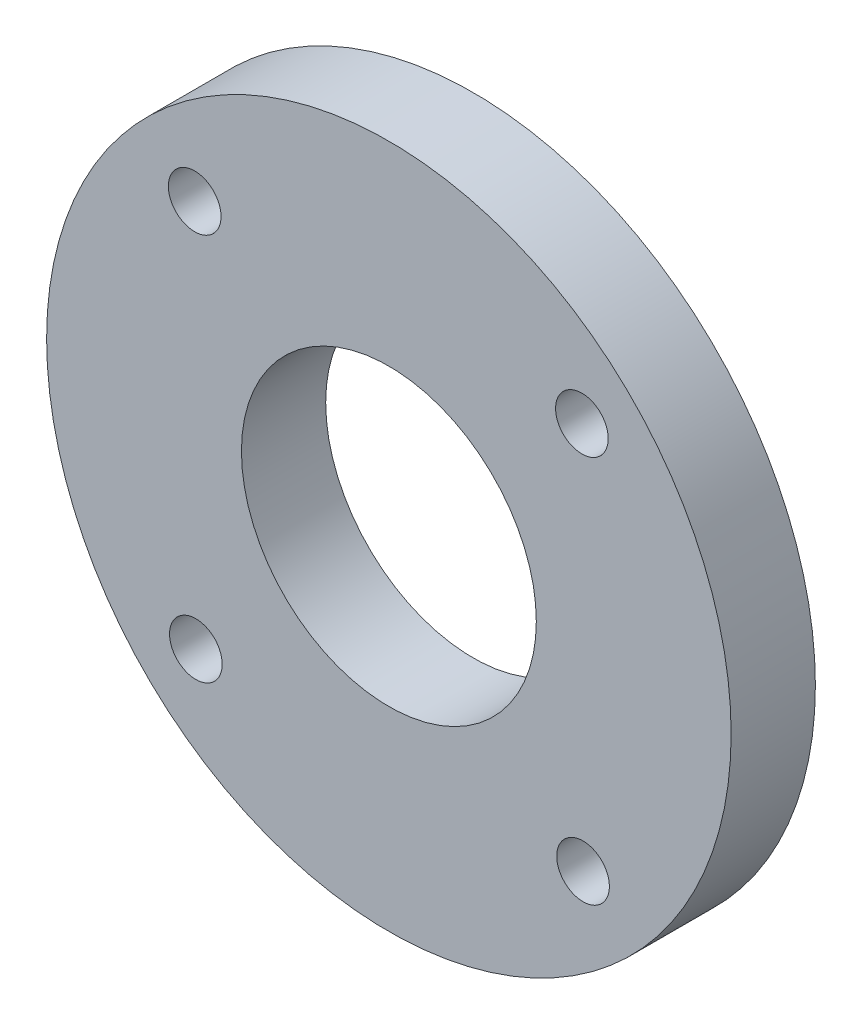
ISO-10303-21;
HEADER;
FILE_DESCRIPTION(('STEP AP214'),'2;1');
FILE_NAME('part.step','',(''),(''),'','','');
FILE_SCHEMA(('AUTOMOTIVE_DESIGN { 1 0 10303 214 1 1 1 1 }'));
ENDSEC;
DATA;
#1=APPLICATION_CONTEXT('core data for automotive mechanical design processes');
#2=APPLICATION_PROTOCOL_DEFINITION('international standard','automotive_design',2000,#1);
#3=PRODUCT_CONTEXT('',#1,'mechanical');
#4=PRODUCT('Part','Part','',(#3));
#5=PRODUCT_RELATED_PRODUCT_CATEGORY('part','',(#4));
#6=PRODUCT_DEFINITION_FORMATION('','',#4);
#7=PRODUCT_DEFINITION_CONTEXT('part definition',#1,'design');
#8=PRODUCT_DEFINITION('design','',#6,#7);
#9=PRODUCT_DEFINITION_SHAPE('','',#8);
#10=(LENGTH_UNIT() NAMED_UNIT(*) SI_UNIT(.MILLI.,.METRE.));
#11=(NAMED_UNIT(*) PLANE_ANGLE_UNIT() SI_UNIT($,.RADIAN.));
#12=(NAMED_UNIT(*) SI_UNIT($,.STERADIAN.) SOLID_ANGLE_UNIT());
#13=UNCERTAINTY_MEASURE_WITH_UNIT(LENGTH_MEASURE(1.E-05),#10,'distance_accuracy_value','');
#14=(GEOMETRIC_REPRESENTATION_CONTEXT(3) GLOBAL_UNCERTAINTY_ASSIGNED_CONTEXT((#13)) GLOBAL_UNIT_ASSIGNED_CONTEXT((#10,
#11,#12)) REPRESENTATION_CONTEXT('',''));
#15=CARTESIAN_POINT('',(0.,0.,0.));
#16=DIRECTION('',(0.,0.,1.));
#17=DIRECTION('',(1.,0.,0.));
#18=AXIS2_PLACEMENT_3D('',#15,#16,#17);
#19=CARTESIAN_POINT('',(0.,0.,8.));
#20=DIRECTION('',(0.,0.,1.));
#21=DIRECTION('',(1.,0.,0.));
#22=AXIS2_PLACEMENT_3D('',#19,#20,#21);
#23=PLANE('',#22);
#24=CARTESIAN_POINT('',(18.438809137447,-18.3277315633268,8.));
#25=DIRECTION('',(0.,0.,1.));
#26=DIRECTION('',(1.,0.,0.));
#27=AXIS2_PLACEMENT_3D('',#24,#25,#26);
#28=CIRCLE('',#27,2.5);
#29=CARTESIAN_POINT('',(20.938809137447,-18.3277315633268,8.));
#30=VERTEX_POINT('',#29);
#31=EDGE_CURVE('E56',#30,#30,#28,.T.);
#32=ORIENTED_EDGE('',*,*,#31,.F.);
#33=EDGE_LOOP('',(#32));
#34=FACE_BOUND('',#33,.T.);
#35=CARTESIAN_POINT('',(-18.3277315633268,-18.438809137447,8.));
#36=DIRECTION('',(0.,0.,1.));
#37=DIRECTION('',(1.,0.,0.));
#38=AXIS2_PLACEMENT_3D('',#35,#36,#37);
#39=CIRCLE('',#38,2.5);
#40=CARTESIAN_POINT('',(-15.8277315633268,-18.438809137447,8.));
#41=VERTEX_POINT('',#40);
#42=EDGE_CURVE('E44',#41,#41,#39,.T.);
#43=ORIENTED_EDGE('',*,*,#42,.F.);
#44=EDGE_LOOP('',(#43));
#45=FACE_BOUND('',#44,.T.);
#46=CARTESIAN_POINT('',(0.,0.,8.));
#47=DIRECTION('',(0.,0.,1.));
#48=DIRECTION('',(1.,0.,0.));
#49=AXIS2_PLACEMENT_3D('',#46,#47,#48);
#50=CIRCLE('',#49,32.5);
#51=CARTESIAN_POINT('',(32.5,0.,8.));
#52=VERTEX_POINT('',#51);
#53=EDGE_CURVE('E10',#52,#52,#50,.T.);
#54=ORIENTED_EDGE('',*,*,#53,.T.);
#55=EDGE_LOOP('',(#54));
#56=FACE_BOUND('',#55,.T.);
#57=CARTESIAN_POINT('',(-18.4388091374469,18.3277315633269,8.));
#58=DIRECTION('',(0.,0.,1.));
#59=DIRECTION('',(1.,0.,0.));
#60=AXIS2_PLACEMENT_3D('',#57,#58,#59);
#61=CIRCLE('',#60,2.5);
#62=CARTESIAN_POINT('',(-15.9388091374469,18.3277315633269,8.));
#63=VERTEX_POINT('',#62);
#64=EDGE_CURVE('E39',#63,#63,#61,.T.);
#65=ORIENTED_EDGE('',*,*,#64,.F.);
#66=EDGE_LOOP('',(#65));
#67=FACE_BOUND('',#66,.T.);
#68=CARTESIAN_POINT('',(18.3277315633267,18.4388091374471,8.));
#69=DIRECTION('',(0.,0.,1.));
#70=DIRECTION('',(1.,0.,0.));
#71=AXIS2_PLACEMENT_3D('',#68,#69,#70);
#72=CIRCLE('',#71,2.5);
#73=CARTESIAN_POINT('',(20.8277315633267,18.4388091374471,8.));
#74=VERTEX_POINT('',#73);
#75=EDGE_CURVE('E50',#74,#74,#72,.T.);
#76=ORIENTED_EDGE('',*,*,#75,.F.);
#77=EDGE_LOOP('',(#76));
#78=FACE_BOUND('',#77,.T.);
#79=CARTESIAN_POINT('',(0.,0.,8.));
#80=DIRECTION('',(0.,0.,1.));
#81=DIRECTION('',(1.,0.,0.));
#82=AXIS2_PLACEMENT_3D('',#79,#80,#81);
#83=CIRCLE('',#82,14.);
#84=CARTESIAN_POINT('',(14.,0.,8.));
#85=VERTEX_POINT('',#84);
#86=EDGE_CURVE('E62',#85,#85,#83,.T.);
#87=ORIENTED_EDGE('',*,*,#86,.F.);
#88=EDGE_LOOP('',(#87));
#89=FACE_BOUND('',#88,.T.);
#90=ADVANCED_FACE('F28',(#34,#45,#56,#67,#78,#89),#23,.T.);
#91=CARTESIAN_POINT('',(0.,0.,0.));
#92=DIRECTION('',(0.,0.,1.));
#93=DIRECTION('',(1.,0.,0.));
#94=AXIS2_PLACEMENT_3D('',#91,#92,#93);
#95=PLANE('',#94);
#96=CARTESIAN_POINT('',(18.438809137447,-18.3277315633268,0.));
#97=DIRECTION('',(0.,0.,1.));
#98=DIRECTION('',(1.,0.,0.));
#99=AXIS2_PLACEMENT_3D('',#96,#97,#98);
#100=CIRCLE('',#99,2.5);
#101=CARTESIAN_POINT('',(20.938809137447,-18.3277315633268,0.));
#102=VERTEX_POINT('',#101);
#103=EDGE_CURVE('E59',#102,#102,#100,.T.);
#104=ORIENTED_EDGE('',*,*,#103,.T.);
#105=EDGE_LOOP('',(#104));
#106=FACE_BOUND('',#105,.T.);
#107=CARTESIAN_POINT('',(-18.3277315633268,-18.438809137447,0.));
#108=DIRECTION('',(0.,0.,1.));
#109=DIRECTION('',(1.,0.,0.));
#110=AXIS2_PLACEMENT_3D('',#107,#108,#109);
#111=CIRCLE('',#110,2.5);
#112=CARTESIAN_POINT('',(-15.8277315633268,-18.438809137447,0.));
#113=VERTEX_POINT('',#112);
#114=EDGE_CURVE('E47',#113,#113,#111,.T.);
#115=ORIENTED_EDGE('',*,*,#114,.T.);
#116=EDGE_LOOP('',(#115));
#117=FACE_BOUND('',#116,.T.);
#118=CARTESIAN_POINT('',(0.,0.,0.));
#119=DIRECTION('',(0.,0.,1.));
#120=DIRECTION('',(1.,0.,0.));
#121=AXIS2_PLACEMENT_3D('',#118,#119,#120);
#122=CIRCLE('',#121,32.5);
#123=CARTESIAN_POINT('',(32.5,0.,0.));
#124=VERTEX_POINT('',#123);
#125=EDGE_CURVE('E32',#124,#124,#122,.T.);
#126=ORIENTED_EDGE('',*,*,#125,.F.);
#127=EDGE_LOOP('',(#126));
#128=FACE_BOUND('',#127,.T.);
#129=CARTESIAN_POINT('',(-18.4388091374469,18.3277315633269,0.));
#130=DIRECTION('',(0.,0.,1.));
#131=DIRECTION('',(1.,0.,0.));
#132=AXIS2_PLACEMENT_3D('',#129,#130,#131);
#133=CIRCLE('',#132,2.5);
#134=CARTESIAN_POINT('',(-15.9388091374469,18.3277315633269,0.));
#135=VERTEX_POINT('',#134);
#136=EDGE_CURVE('E41',#135,#135,#133,.T.);
#137=ORIENTED_EDGE('',*,*,#136,.T.);
#138=EDGE_LOOP('',(#137));
#139=FACE_BOUND('',#138,.T.);
#140=CARTESIAN_POINT('',(18.3277315633267,18.4388091374471,0.));
#141=DIRECTION('',(0.,0.,1.));
#142=DIRECTION('',(1.,0.,0.));
#143=AXIS2_PLACEMENT_3D('',#140,#141,#142);
#144=CIRCLE('',#143,2.5);
#145=CARTESIAN_POINT('',(20.8277315633267,18.4388091374471,0.));
#146=VERTEX_POINT('',#145);
#147=EDGE_CURVE('E53',#146,#146,#144,.T.);
#148=ORIENTED_EDGE('',*,*,#147,.T.);
#149=EDGE_LOOP('',(#148));
#150=FACE_BOUND('',#149,.T.);
#151=CARTESIAN_POINT('',(0.,0.,0.));
#152=DIRECTION('',(0.,0.,1.));
#153=DIRECTION('',(1.,0.,0.));
#154=AXIS2_PLACEMENT_3D('',#151,#152,#153);
#155=CIRCLE('',#154,14.);
#156=CARTESIAN_POINT('',(14.,0.,0.));
#157=VERTEX_POINT('',#156);
#158=EDGE_CURVE('E65',#157,#157,#155,.T.);
#159=ORIENTED_EDGE('',*,*,#158,.T.);
#160=EDGE_LOOP('',(#159));
#161=FACE_BOUND('',#160,.T.);
#162=ADVANCED_FACE('F75',(#106,#117,#128,#139,#150,#161),#95,.F.);
#163=CARTESIAN_POINT('',(0.,0.,8.));
#164=DIRECTION('',(0.,0.,-1.));
#165=DIRECTION('',(-1.,0.,0.));
#166=AXIS2_PLACEMENT_3D('',#163,#164,#165);
#167=CYLINDRICAL_SURFACE('',#166,32.5);
#168=ORIENTED_EDGE('',*,*,#53,.F.);
#169=EDGE_LOOP('',(#168));
#170=FACE_BOUND('',#169,.T.);
#171=ORIENTED_EDGE('',*,*,#125,.T.);
#172=EDGE_LOOP('',(#171));
#173=FACE_BOUND('',#172,.T.);
#174=ADVANCED_FACE('F30',(#170,#173),#167,.T.);
#175=CARTESIAN_POINT('',(-18.4388091374469,18.3277315633269,8.));
#176=DIRECTION('',(0.,0.,-1.));
#177=DIRECTION('',(-1.,0.,0.));
#178=AXIS2_PLACEMENT_3D('',#175,#176,#177);
#179=CYLINDRICAL_SURFACE('',#178,2.5);
#180=ORIENTED_EDGE('',*,*,#64,.T.);
#181=EDGE_LOOP('',(#180));
#182=FACE_BOUND('',#181,.T.);
#183=ORIENTED_EDGE('',*,*,#136,.F.);
#184=EDGE_LOOP('',(#183));
#185=FACE_BOUND('',#184,.T.);
#186=ADVANCED_FACE('F85',(#182,#185),#179,.F.);
#187=CARTESIAN_POINT('',(-18.3277315633268,-18.438809137447,8.));
#188=DIRECTION('',(0.,0.,-1.));
#189=DIRECTION('',(-1.,0.,0.));
#190=AXIS2_PLACEMENT_3D('',#187,#188,#189);
#191=CYLINDRICAL_SURFACE('',#190,2.5);
#192=ORIENTED_EDGE('',*,*,#42,.T.);
#193=EDGE_LOOP('',(#192));
#194=FACE_BOUND('',#193,.T.);
#195=ORIENTED_EDGE('',*,*,#114,.F.);
#196=EDGE_LOOP('',(#195));
#197=FACE_BOUND('',#196,.T.);
#198=ADVANCED_FACE('F88',(#194,#197),#191,.F.);
#199=CARTESIAN_POINT('',(18.3277315633267,18.4388091374471,8.));
#200=DIRECTION('',(0.,0.,-1.));
#201=DIRECTION('',(-1.,0.,0.));
#202=AXIS2_PLACEMENT_3D('',#199,#200,#201);
#203=CYLINDRICAL_SURFACE('',#202,2.5);
#204=ORIENTED_EDGE('',*,*,#75,.T.);
#205=EDGE_LOOP('',(#204));
#206=FACE_BOUND('',#205,.T.);
#207=ORIENTED_EDGE('',*,*,#147,.F.);
#208=EDGE_LOOP('',(#207));
#209=FACE_BOUND('',#208,.T.);
#210=ADVANCED_FACE('F92',(#206,#209),#203,.F.);
#211=CARTESIAN_POINT('',(18.438809137447,-18.3277315633268,8.));
#212=DIRECTION('',(0.,0.,-1.));
#213=DIRECTION('',(-1.,0.,0.));
#214=AXIS2_PLACEMENT_3D('',#211,#212,#213);
#215=CYLINDRICAL_SURFACE('',#214,2.5);
#216=ORIENTED_EDGE('',*,*,#31,.T.);
#217=EDGE_LOOP('',(#216));
#218=FACE_BOUND('',#217,.T.);
#219=ORIENTED_EDGE('',*,*,#103,.F.);
#220=EDGE_LOOP('',(#219));
#221=FACE_BOUND('',#220,.T.);
#222=ADVANCED_FACE('F96',(#218,#221),#215,.F.);
#223=CARTESIAN_POINT('',(0.,0.,8.));
#224=DIRECTION('',(0.,0.,-1.));
#225=DIRECTION('',(-1.,0.,0.));
#226=AXIS2_PLACEMENT_3D('',#223,#224,#225);
#227=CYLINDRICAL_SURFACE('',#226,14.);
#228=ORIENTED_EDGE('',*,*,#86,.T.);
#229=EDGE_LOOP('',(#228));
#230=FACE_BOUND('',#229,.T.);
#231=ORIENTED_EDGE('',*,*,#158,.F.);
#232=EDGE_LOOP('',(#231));
#233=FACE_BOUND('',#232,.T.);
#234=ADVANCED_FACE('F71',(#230,#233),#227,.F.);
#235=CLOSED_SHELL('',(#90,#162,#174,#186,#198,#210,#222,#234));
#236=MANIFOLD_SOLID_BREP('B2',#235);
#237=ADVANCED_BREP_SHAPE_REPRESENTATION('',(#18,#236),#14);
#238=SHAPE_DEFINITION_REPRESENTATION(#9,#237);
ENDSEC;
END-ISO-10303-21;
